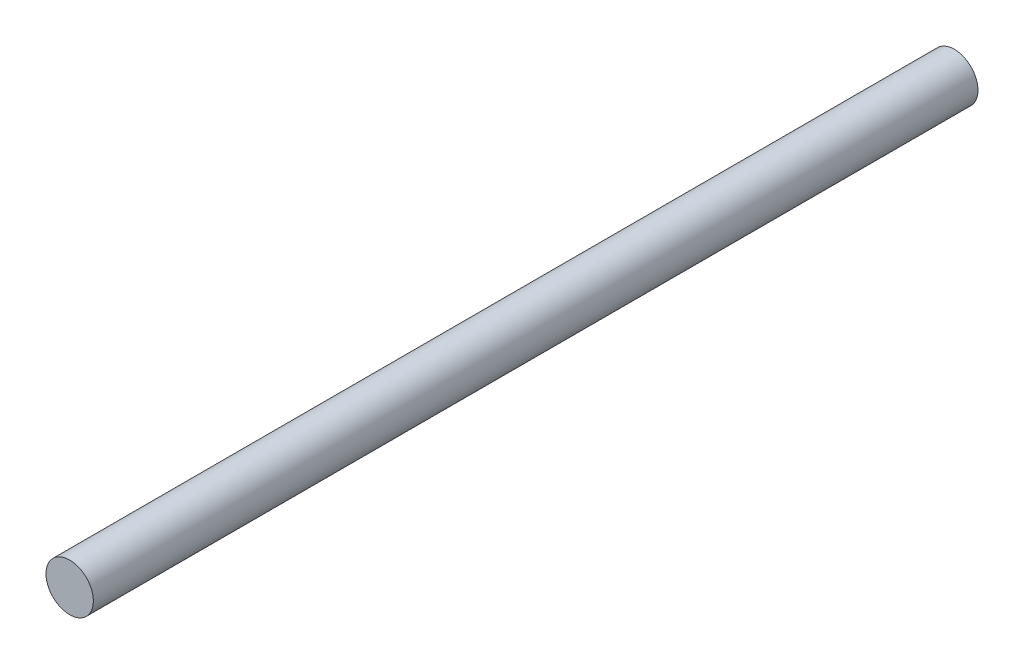
ISO-10303-21;
HEADER;
FILE_DESCRIPTION(('STEP AP214'),'2;1');
FILE_NAME('part.step','',(''),(''),'','','');
FILE_SCHEMA(('AUTOMOTIVE_DESIGN { 1 0 10303 214 1 1 1 1 }'));
ENDSEC;
DATA;
#1=APPLICATION_CONTEXT('core data for automotive mechanical design processes');
#2=APPLICATION_PROTOCOL_DEFINITION('international standard','automotive_design',2000,#1);
#3=PRODUCT_CONTEXT('',#1,'mechanical');
#4=PRODUCT('Part','Part','',(#3));
#5=PRODUCT_RELATED_PRODUCT_CATEGORY('part','',(#4));
#6=PRODUCT_DEFINITION_FORMATION('','',#4);
#7=PRODUCT_DEFINITION_CONTEXT('part definition',#1,'design');
#8=PRODUCT_DEFINITION('design','',#6,#7);
#9=PRODUCT_DEFINITION_SHAPE('','',#8);
#10=(LENGTH_UNIT() NAMED_UNIT(*) SI_UNIT(.MILLI.,.METRE.));
#11=(NAMED_UNIT(*) PLANE_ANGLE_UNIT() SI_UNIT($,.RADIAN.));
#12=(NAMED_UNIT(*) SI_UNIT($,.STERADIAN.) SOLID_ANGLE_UNIT());
#13=UNCERTAINTY_MEASURE_WITH_UNIT(LENGTH_MEASURE(1.E-05),#10,'distance_accuracy_value','');
#14=(GEOMETRIC_REPRESENTATION_CONTEXT(3) GLOBAL_UNCERTAINTY_ASSIGNED_CONTEXT((#13)) GLOBAL_UNIT_ASSIGNED_CONTEXT((#10,
#11,#12)) REPRESENTATION_CONTEXT('',''));
#15=CARTESIAN_POINT('',(0.,0.,0.));
#16=DIRECTION('',(0.,0.,1.));
#17=DIRECTION('',(1.,0.,0.));
#18=AXIS2_PLACEMENT_3D('',#15,#16,#17);
#19=CARTESIAN_POINT('',(0.,0.,1066.8));
#20=DIRECTION('',(0.,0.,-1.));
#21=DIRECTION('',(-1.,0.,0.));
#22=AXIS2_PLACEMENT_3D('',#19,#20,#21);
#23=CYLINDRICAL_SURFACE('',#22,28.575);
#24=CARTESIAN_POINT('',(0.,0.,1066.8));
#25=DIRECTION('',(0.,0.,1.));
#26=DIRECTION('',(1.,0.,0.));
#27=AXIS2_PLACEMENT_3D('',#24,#25,#26);
#28=CIRCLE('',#27,28.575);
#29=CARTESIAN_POINT('',(28.575,0.,1066.8));
#30=VERTEX_POINT('',#29);
#31=EDGE_CURVE('E10',#30,#30,#28,.T.);
#32=ORIENTED_EDGE('',*,*,#31,.F.);
#33=EDGE_LOOP('',(#32));
#34=FACE_BOUND('',#33,.T.);
#35=CARTESIAN_POINT('',(0.,0.,0.));
#36=DIRECTION('',(0.,0.,1.));
#37=DIRECTION('',(1.,0.,0.));
#38=AXIS2_PLACEMENT_3D('',#35,#36,#37);
#39=CIRCLE('',#38,28.575);
#40=CARTESIAN_POINT('',(28.575,0.,0.));
#41=VERTEX_POINT('',#40);
#42=EDGE_CURVE('E34',#41,#41,#39,.T.);
#43=ORIENTED_EDGE('',*,*,#42,.T.);
#44=EDGE_LOOP('',(#43));
#45=FACE_BOUND('',#44,.T.);
#46=ADVANCED_FACE('F31',(#34,#45),#23,.T.);
#47=CARTESIAN_POINT('',(0.,0.,1066.8));
#48=DIRECTION('',(0.,0.,1.));
#49=DIRECTION('',(1.,0.,0.));
#50=AXIS2_PLACEMENT_3D('',#47,#48,#49);
#51=PLANE('',#50);
#52=ORIENTED_EDGE('',*,*,#31,.T.);
#53=EDGE_LOOP('',(#52));
#54=FACE_BOUND('',#53,.T.);
#55=ADVANCED_FACE('F46',(#54),#51,.T.);
#56=CARTESIAN_POINT('',(0.,0.,0.));
#57=DIRECTION('',(0.,0.,1.));
#58=DIRECTION('',(1.,0.,0.));
#59=AXIS2_PLACEMENT_3D('',#56,#57,#58);
#60=PLANE('',#59);
#61=ORIENTED_EDGE('',*,*,#42,.F.);
#62=EDGE_LOOP('',(#61));
#63=FACE_BOUND('',#62,.T.);
#64=ADVANCED_FACE('F44',(#63),#60,.F.);
#65=CLOSED_SHELL('',(#46,#55,#64));
#66=MANIFOLD_SOLID_BREP('B2',#65);
#67=ADVANCED_BREP_SHAPE_REPRESENTATION('',(#18,#66),#14);
#68=SHAPE_DEFINITION_REPRESENTATION(#9,#67);
ENDSEC;
END-ISO-10303-21;
